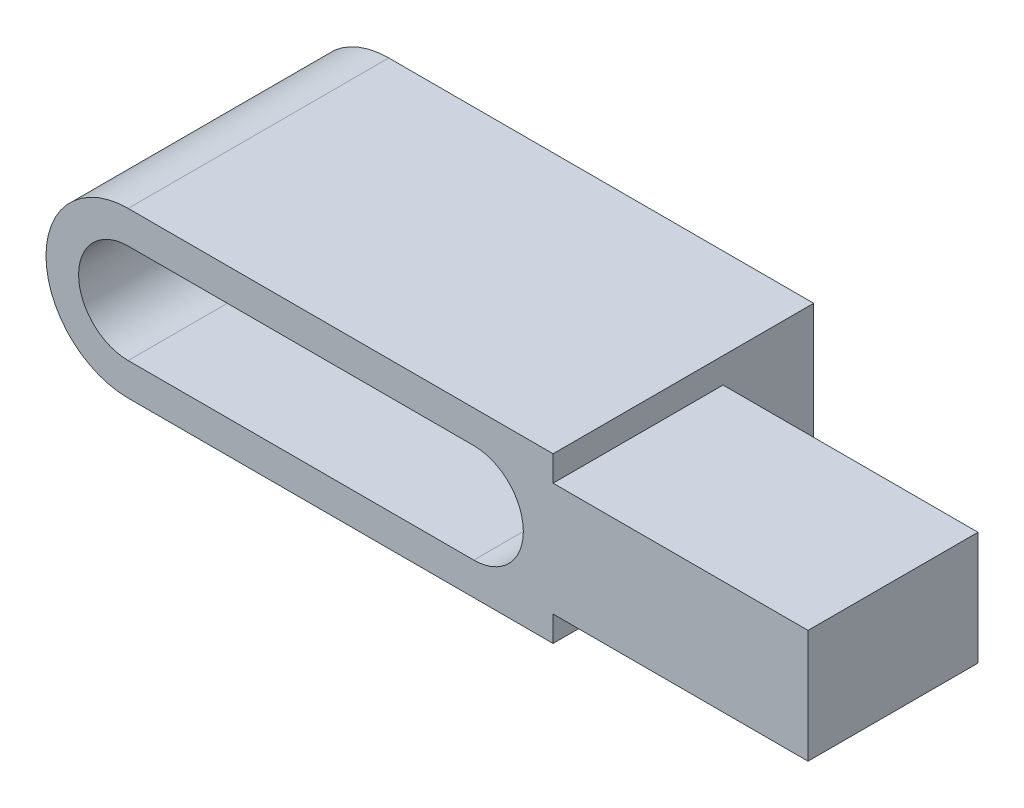
ISO-10303-21;
HEADER;
FILE_DESCRIPTION(('STEP AP214'),'2;1');
FILE_NAME('part.step','',(''),(''),'','','');
FILE_SCHEMA(('AUTOMOTIVE_DESIGN { 1 0 10303 214 1 1 1 1 }'));
ENDSEC;
DATA;
#1=APPLICATION_CONTEXT('core data for automotive mechanical design processes');
#2=APPLICATION_PROTOCOL_DEFINITION('international standard','automotive_design',2000,#1);
#3=PRODUCT_CONTEXT('',#1,'mechanical');
#4=PRODUCT('Part','Part','',(#3));
#5=PRODUCT_RELATED_PRODUCT_CATEGORY('part','',(#4));
#6=PRODUCT_DEFINITION_FORMATION('','',#4);
#7=PRODUCT_DEFINITION_CONTEXT('part definition',#1,'design');
#8=PRODUCT_DEFINITION('design','',#6,#7);
#9=PRODUCT_DEFINITION_SHAPE('','',#8);
#10=(LENGTH_UNIT() NAMED_UNIT(*) SI_UNIT(.MILLI.,.METRE.));
#11=(NAMED_UNIT(*) PLANE_ANGLE_UNIT() SI_UNIT($,.RADIAN.));
#12=(NAMED_UNIT(*) SI_UNIT($,.STERADIAN.) SOLID_ANGLE_UNIT());
#13=UNCERTAINTY_MEASURE_WITH_UNIT(LENGTH_MEASURE(1.E-05),#10,'distance_accuracy_value','');
#14=(GEOMETRIC_REPRESENTATION_CONTEXT(3) GLOBAL_UNCERTAINTY_ASSIGNED_CONTEXT((#13)) GLOBAL_UNIT_ASSIGNED_CONTEXT((#10,
#11,#12)) REPRESENTATION_CONTEXT('',''));
#15=CARTESIAN_POINT('',(0.,0.,0.));
#16=DIRECTION('',(0.,0.,1.));
#17=DIRECTION('',(1.,0.,0.));
#18=AXIS2_PLACEMENT_3D('',#15,#16,#17);
#19=CARTESIAN_POINT('',(0.,0.,3.2));
#20=DIRECTION('',(0.,0.,-1.));
#21=DIRECTION('',(-1.,0.,0.));
#22=AXIS2_PLACEMENT_3D('',#19,#20,#21);
#23=CYLINDRICAL_SURFACE('',#22,2.9);
#24=CARTESIAN_POINT('',(0.,0.,0.));
#25=DIRECTION('',(0.,0.,1.));
#26=DIRECTION('',(1.,0.,0.));
#27=AXIS2_PLACEMENT_3D('',#24,#25,#26);
#28=CIRCLE('',#27,2.9);
#29=CARTESIAN_POINT('',(0.,2.9,0.));
#30=VERTEX_POINT('',#29);
#31=CARTESIAN_POINT('',(0.,-2.9,0.));
#32=VERTEX_POINT('',#31);
#33=EDGE_CURVE('E199',#30,#32,#28,.T.);
#34=ORIENTED_EDGE('',*,*,#33,.T.);
#35=DIRECTION('',(0.,0.,-1.));
#36=VECTOR('',#35,1.);
#37=CARTESIAN_POINT('',(0.,-2.9,3.2));
#38=LINE('',#37,#36);
#39=CARTESIAN_POINT('',(0.,-2.9,9.2));
#40=VERTEX_POINT('',#39);
#41=EDGE_CURVE('E11',#40,#32,#38,.T.);
#42=ORIENTED_EDGE('',*,*,#41,.F.);
#43=CARTESIAN_POINT('',(0.,0.,9.2));
#44=DIRECTION('',(0.,0.,1.));
#45=DIRECTION('',(1.,0.,0.));
#46=AXIS2_PLACEMENT_3D('',#43,#44,#45);
#47=CIRCLE('',#46,2.9);
#48=CARTESIAN_POINT('',(0.,2.9,9.2));
#49=VERTEX_POINT('',#48);
#50=EDGE_CURVE('E161',#49,#40,#47,.T.);
#51=ORIENTED_EDGE('',*,*,#50,.F.);
#52=DIRECTION('',(0.,0.,-1.));
#53=VECTOR('',#52,1.);
#54=CARTESIAN_POINT('',(0.,2.9,3.2));
#55=LINE('',#54,#53);
#56=EDGE_CURVE('E202',#49,#30,#55,.T.);
#57=ORIENTED_EDGE('',*,*,#56,.T.);
#58=EDGE_LOOP('',(#34,#42,#51,#57));
#59=FACE_BOUND('',#58,.T.);
#60=ADVANCED_FACE('F36',(#59),#23,.T.);
#61=CARTESIAN_POINT('',(15.,-2.9,3.2));
#62=DIRECTION('',(0.,1.,0.));
#63=DIRECTION('',(-1.,0.,0.));
#64=AXIS2_PLACEMENT_3D('',#61,#62,#63);
#65=PLANE('',#64);
#66=DIRECTION('',(1.,0.,0.));
#67=VECTOR('',#66,1.);
#68=CARTESIAN_POINT('',(15.,-2.9,0.));
#69=LINE('',#68,#67);
#70=CARTESIAN_POINT('',(15.,-2.9,0.));
#71=VERTEX_POINT('',#70);
#72=EDGE_CURVE('E206',#32,#71,#69,.T.);
#73=ORIENTED_EDGE('',*,*,#72,.T.);
#74=DIRECTION('',(0.,0.,-1.));
#75=VECTOR('',#74,1.);
#76=CARTESIAN_POINT('',(15.,-2.9,3.2));
#77=LINE('',#76,#75);
#78=CARTESIAN_POINT('',(15.,-2.9,9.2));
#79=VERTEX_POINT('',#78);
#80=EDGE_CURVE('E43',#79,#71,#77,.T.);
#81=ORIENTED_EDGE('',*,*,#80,.F.);
#82=DIRECTION('',(1.,0.,0.));
#83=VECTOR('',#82,1.);
#84=CARTESIAN_POINT('',(0.,-2.9,9.2));
#85=LINE('',#84,#83);
#86=EDGE_CURVE('E164',#40,#79,#85,.T.);
#87=ORIENTED_EDGE('',*,*,#86,.F.);
#88=ORIENTED_EDGE('',*,*,#41,.T.);
#89=EDGE_LOOP('',(#73,#81,#87,#88));
#90=FACE_BOUND('',#89,.T.);
#91=ADVANCED_FACE('F259',(#90),#65,.F.);
#92=CARTESIAN_POINT('',(15.,2.9,3.2));
#93=DIRECTION('',(-1.,0.,0.));
#94=DIRECTION('',(0.,0.,1.));
#95=AXIS2_PLACEMENT_3D('',#92,#93,#94);
#96=PLANE('',#95);
#97=DIRECTION('',(0.,1.,0.));
#98=VECTOR('',#97,1.);
#99=CARTESIAN_POINT('',(15.,2.9,0.));
#100=LINE('',#99,#98);
#101=CARTESIAN_POINT('',(15.,2.9,0.));
#102=VERTEX_POINT('',#101);
#103=EDGE_CURVE('E208',#71,#102,#100,.T.);
#104=ORIENTED_EDGE('',*,*,#103,.T.);
#105=DIRECTION('',(0.,0.,-1.));
#106=VECTOR('',#105,1.);
#107=CARTESIAN_POINT('',(15.,2.9,3.2));
#108=LINE('',#107,#106);
#109=CARTESIAN_POINT('',(15.,2.9,9.2));
#110=VERTEX_POINT('',#109);
#111=EDGE_CURVE('E213',#110,#102,#108,.T.);
#112=ORIENTED_EDGE('',*,*,#111,.F.);
#113=DIRECTION('',(0.,1.,0.));
#114=VECTOR('',#113,1.);
#115=CARTESIAN_POINT('',(15.,2.9,9.2));
#116=LINE('',#115,#114);
#117=CARTESIAN_POINT('',(15.,2.,9.2));
#118=VERTEX_POINT('',#117);
#119=EDGE_CURVE('E176',#118,#110,#116,.T.);
#120=ORIENTED_EDGE('',*,*,#119,.F.);
#121=DIRECTION('',(0.,0.,-1.));
#122=VECTOR('',#121,1.);
#123=CARTESIAN_POINT('',(15.,2.,9.2));
#124=LINE('',#123,#122);
#125=CARTESIAN_POINT('',(15.,2.,3.2));
#126=VERTEX_POINT('',#125);
#127=EDGE_CURVE('E182',#118,#126,#124,.T.);
#128=ORIENTED_EDGE('',*,*,#127,.T.);
#129=DIRECTION('',(0.,1.,0.));
#130=VECTOR('',#129,1.);
#131=CARTESIAN_POINT('',(15.,2.9,3.2));
#132=LINE('',#131,#130);
#133=CARTESIAN_POINT('',(15.,-2.,3.2));
#134=VERTEX_POINT('',#133);
#135=EDGE_CURVE('E200',#134,#126,#132,.T.);
#136=ORIENTED_EDGE('',*,*,#135,.F.);
#137=DIRECTION('',(0.,0.,-1.));
#138=VECTOR('',#137,1.);
#139=CARTESIAN_POINT('',(15.,-2.,9.2));
#140=LINE('',#139,#138);
#141=CARTESIAN_POINT('',(15.,-2.,9.2));
#142=VERTEX_POINT('',#141);
#143=EDGE_CURVE('E196',#142,#134,#140,.T.);
#144=ORIENTED_EDGE('',*,*,#143,.F.);
#145=DIRECTION('',(0.,1.,0.));
#146=VECTOR('',#145,1.);
#147=CARTESIAN_POINT('',(15.,-2.9,9.2));
#148=LINE('',#147,#146);
#149=EDGE_CURVE('E168',#79,#142,#148,.T.);
#150=ORIENTED_EDGE('',*,*,#149,.F.);
#151=ORIENTED_EDGE('',*,*,#80,.T.);
#152=EDGE_LOOP('',(#104,#112,#120,#128,#136,#144,#150,#151));
#153=FACE_BOUND('',#152,.T.);
#154=ADVANCED_FACE('F219',(#153),#96,.F.);
#155=CARTESIAN_POINT('',(0.,2.9,3.2));
#156=DIRECTION('',(0.,-1.,0.));
#157=DIRECTION('',(1.,0.,0.));
#158=AXIS2_PLACEMENT_3D('',#155,#156,#157);
#159=PLANE('',#158);
#160=DIRECTION('',(-1.,0.,0.));
#161=VECTOR('',#160,1.);
#162=CARTESIAN_POINT('',(0.,2.9,0.));
#163=LINE('',#162,#161);
#164=EDGE_CURVE('E203',#102,#30,#163,.T.);
#165=ORIENTED_EDGE('',*,*,#164,.T.);
#166=ORIENTED_EDGE('',*,*,#56,.F.);
#167=DIRECTION('',(-1.,0.,0.));
#168=VECTOR('',#167,1.);
#169=CARTESIAN_POINT('',(15.,2.9,9.2));
#170=LINE('',#169,#168);
#171=EDGE_CURVE('E179',#110,#49,#170,.T.);
#172=ORIENTED_EDGE('',*,*,#171,.F.);
#173=ORIENTED_EDGE('',*,*,#111,.T.);
#174=EDGE_LOOP('',(#165,#166,#172,#173));
#175=FACE_BOUND('',#174,.T.);
#176=ADVANCED_FACE('F226',(#175),#159,.F.);
#177=CARTESIAN_POINT('',(0.,0.,0.));
#178=DIRECTION('',(0.,0.,1.));
#179=DIRECTION('',(1.,0.,0.));
#180=AXIS2_PLACEMENT_3D('',#177,#178,#179);
#181=PLANE('',#180);
#182=DIRECTION('',(1.,0.,0.));
#183=VECTOR('',#182,1.);
#184=CARTESIAN_POINT('',(12.2,-1.75,0.));
#185=LINE('',#184,#183);
#186=CARTESIAN_POINT('',(0.,-1.75,0.));
#187=VERTEX_POINT('',#186);
#188=CARTESIAN_POINT('',(12.2,-1.75,0.));
#189=VERTEX_POINT('',#188);
#190=EDGE_CURVE('E132',#187,#189,#185,.T.);
#191=ORIENTED_EDGE('',*,*,#190,.T.);
#192=CARTESIAN_POINT('',(12.2,0.,0.));
#193=DIRECTION('',(0.,0.,1.));
#194=DIRECTION('',(1.,0.,0.));
#195=AXIS2_PLACEMENT_3D('',#192,#193,#194);
#196=CIRCLE('',#195,1.75);
#197=CARTESIAN_POINT('',(12.2,1.75,0.));
#198=VERTEX_POINT('',#197);
#199=EDGE_CURVE('E126',#189,#198,#196,.T.);
#200=ORIENTED_EDGE('',*,*,#199,.T.);
#201=DIRECTION('',(-1.,0.,0.));
#202=VECTOR('',#201,1.);
#203=CARTESIAN_POINT('',(0.,1.75,0.));
#204=LINE('',#203,#202);
#205=CARTESIAN_POINT('',(0.,1.75,0.));
#206=VERTEX_POINT('',#205);
#207=EDGE_CURVE('E135',#198,#206,#204,.T.);
#208=ORIENTED_EDGE('',*,*,#207,.T.);
#209=CARTESIAN_POINT('',(0.,0.,0.));
#210=DIRECTION('',(0.,0.,1.));
#211=DIRECTION('',(1.,0.,0.));
#212=AXIS2_PLACEMENT_3D('',#209,#210,#211);
#213=CIRCLE('',#212,1.75);
#214=EDGE_CURVE('E50',#206,#187,#213,.T.);
#215=ORIENTED_EDGE('',*,*,#214,.T.);
#216=EDGE_LOOP('',(#191,#200,#208,#215));
#217=FACE_BOUND('',#216,.T.);
#218=ORIENTED_EDGE('',*,*,#33,.F.);
#219=ORIENTED_EDGE('',*,*,#164,.F.);
#220=ORIENTED_EDGE('',*,*,#103,.F.);
#221=ORIENTED_EDGE('',*,*,#72,.F.);
#222=EDGE_LOOP('',(#218,#219,#220,#221));
#223=FACE_BOUND('',#222,.T.);
#224=ADVANCED_FACE('F139',(#217,#223),#181,.F.);
#225=CARTESIAN_POINT('',(0.,0.,3.2));
#226=DIRECTION('',(0.,0.,1.));
#227=DIRECTION('',(1.,0.,0.));
#228=AXIS2_PLACEMENT_3D('',#225,#226,#227);
#229=PLANE('',#228);
#230=DIRECTION('',(1.,0.,0.));
#231=VECTOR('',#230,1.);
#232=CARTESIAN_POINT('',(15.,-2.,3.2));
#233=LINE('',#232,#231);
#234=CARTESIAN_POINT('',(24.,-2.,3.2));
#235=VERTEX_POINT('',#234);
#236=EDGE_CURVE('E157',#134,#235,#233,.T.);
#237=ORIENTED_EDGE('',*,*,#236,.F.);
#238=ORIENTED_EDGE('',*,*,#135,.T.);
#239=DIRECTION('',(-1.,0.,0.));
#240=VECTOR('',#239,1.);
#241=CARTESIAN_POINT('',(15.,2.,3.2));
#242=LINE('',#241,#240);
#243=CARTESIAN_POINT('',(24.,2.,3.2));
#244=VERTEX_POINT('',#243);
#245=EDGE_CURVE('E165',#244,#126,#242,.T.);
#246=ORIENTED_EDGE('',*,*,#245,.F.);
#247=DIRECTION('',(0.,1.,0.));
#248=VECTOR('',#247,1.);
#249=CARTESIAN_POINT('',(24.,2.,3.2));
#250=LINE('',#249,#248);
#251=EDGE_CURVE('E184',#235,#244,#250,.T.);
#252=ORIENTED_EDGE('',*,*,#251,.F.);
#253=EDGE_LOOP('',(#237,#238,#246,#252));
#254=FACE_BOUND('',#253,.T.);
#255=ADVANCED_FACE('F242',(#254),#229,.F.);
#256=CARTESIAN_POINT('',(15.,-2.,9.2));
#257=DIRECTION('',(0.,1.,0.));
#258=DIRECTION('',(0.,0.,1.));
#259=AXIS2_PLACEMENT_3D('',#256,#257,#258);
#260=PLANE('',#259);
#261=ORIENTED_EDGE('',*,*,#236,.T.);
#262=DIRECTION('',(0.,0.,-1.));
#263=VECTOR('',#262,1.);
#264=CARTESIAN_POINT('',(24.,-2.,9.2));
#265=LINE('',#264,#263);
#266=CARTESIAN_POINT('',(24.,-2.,9.2));
#267=VERTEX_POINT('',#266);
#268=EDGE_CURVE('E193',#267,#235,#265,.T.);
#269=ORIENTED_EDGE('',*,*,#268,.F.);
#270=DIRECTION('',(1.,0.,0.));
#271=VECTOR('',#270,1.);
#272=CARTESIAN_POINT('',(15.,-2.,9.2));
#273=LINE('',#272,#271);
#274=EDGE_CURVE('E170',#142,#267,#273,.T.);
#275=ORIENTED_EDGE('',*,*,#274,.F.);
#276=ORIENTED_EDGE('',*,*,#143,.T.);
#277=EDGE_LOOP('',(#261,#269,#275,#276));
#278=FACE_BOUND('',#277,.T.);
#279=ADVANCED_FACE('F245',(#278),#260,.F.);
#280=CARTESIAN_POINT('',(24.,2.,9.2));
#281=DIRECTION('',(-1.,0.,0.));
#282=DIRECTION('',(0.,0.,1.));
#283=AXIS2_PLACEMENT_3D('',#280,#281,#282);
#284=PLANE('',#283);
#285=ORIENTED_EDGE('',*,*,#251,.T.);
#286=DIRECTION('',(0.,0.,-1.));
#287=VECTOR('',#286,1.);
#288=CARTESIAN_POINT('',(24.,2.,9.2));
#289=LINE('',#288,#287);
#290=CARTESIAN_POINT('',(24.,2.,9.2));
#291=VERTEX_POINT('',#290);
#292=EDGE_CURVE('E190',#291,#244,#289,.T.);
#293=ORIENTED_EDGE('',*,*,#292,.F.);
#294=DIRECTION('',(0.,1.,0.));
#295=VECTOR('',#294,1.);
#296=CARTESIAN_POINT('',(24.,2.,9.2));
#297=LINE('',#296,#295);
#298=EDGE_CURVE('E172',#267,#291,#297,.T.);
#299=ORIENTED_EDGE('',*,*,#298,.F.);
#300=ORIENTED_EDGE('',*,*,#268,.T.);
#301=EDGE_LOOP('',(#285,#293,#299,#300));
#302=FACE_BOUND('',#301,.T.);
#303=ADVANCED_FACE('F249',(#302),#284,.F.);
#304=CARTESIAN_POINT('',(15.,2.,9.2));
#305=DIRECTION('',(0.,-1.,0.));
#306=DIRECTION('',(0.,0.,-1.));
#307=AXIS2_PLACEMENT_3D('',#304,#305,#306);
#308=PLANE('',#307);
#309=ORIENTED_EDGE('',*,*,#245,.T.);
#310=ORIENTED_EDGE('',*,*,#127,.F.);
#311=DIRECTION('',(-1.,0.,0.));
#312=VECTOR('',#311,1.);
#313=CARTESIAN_POINT('',(15.,2.,9.2));
#314=LINE('',#313,#312);
#315=EDGE_CURVE('E174',#291,#118,#314,.T.);
#316=ORIENTED_EDGE('',*,*,#315,.F.);
#317=ORIENTED_EDGE('',*,*,#292,.T.);
#318=EDGE_LOOP('',(#309,#310,#316,#317));
#319=FACE_BOUND('',#318,.T.);
#320=ADVANCED_FACE('F236',(#319),#308,.F.);
#321=CARTESIAN_POINT('',(0.,0.,9.2));
#322=DIRECTION('',(0.,0.,1.));
#323=DIRECTION('',(1.,0.,0.));
#324=AXIS2_PLACEMENT_3D('',#321,#322,#323);
#325=PLANE('',#324);
#326=CARTESIAN_POINT('',(12.2,0.,9.2));
#327=DIRECTION('',(0.,0.,1.));
#328=DIRECTION('',(1.,0.,0.));
#329=AXIS2_PLACEMENT_3D('',#326,#327,#328);
#330=CIRCLE('',#329,1.75);
#331=CARTESIAN_POINT('',(12.2,-1.75,9.2));
#332=VERTEX_POINT('',#331);
#333=CARTESIAN_POINT('',(12.2,1.75,9.2));
#334=VERTEX_POINT('',#333);
#335=EDGE_CURVE('E58',#332,#334,#330,.T.);
#336=ORIENTED_EDGE('',*,*,#335,.F.);
#337=DIRECTION('',(1.,0.,0.));
#338=VECTOR('',#337,1.);
#339=CARTESIAN_POINT('',(12.2,-1.75,9.2));
#340=LINE('',#339,#338);
#341=CARTESIAN_POINT('',(0.,-1.75,9.2));
#342=VERTEX_POINT('',#341);
#343=EDGE_CURVE('E142',#342,#332,#340,.T.);
#344=ORIENTED_EDGE('',*,*,#343,.F.);
#345=CARTESIAN_POINT('',(0.,0.,9.2));
#346=DIRECTION('',(0.,0.,1.));
#347=DIRECTION('',(1.,0.,0.));
#348=AXIS2_PLACEMENT_3D('',#345,#346,#347);
#349=CIRCLE('',#348,1.75);
#350=CARTESIAN_POINT('',(0.,1.75,9.2));
#351=VERTEX_POINT('',#350);
#352=EDGE_CURVE('E145',#351,#342,#349,.T.);
#353=ORIENTED_EDGE('',*,*,#352,.F.);
#354=DIRECTION('',(-1.,0.,0.));
#355=VECTOR('',#354,1.);
#356=CARTESIAN_POINT('',(0.,1.75,9.2));
#357=LINE('',#356,#355);
#358=EDGE_CURVE('E151',#334,#351,#357,.T.);
#359=ORIENTED_EDGE('',*,*,#358,.F.);
#360=EDGE_LOOP('',(#336,#344,#353,#359));
#361=FACE_BOUND('',#360,.T.);
#362=ORIENTED_EDGE('',*,*,#50,.T.);
#363=ORIENTED_EDGE('',*,*,#86,.T.);
#364=ORIENTED_EDGE('',*,*,#149,.T.);
#365=ORIENTED_EDGE('',*,*,#274,.T.);
#366=ORIENTED_EDGE('',*,*,#298,.T.);
#367=ORIENTED_EDGE('',*,*,#315,.T.);
#368=ORIENTED_EDGE('',*,*,#119,.T.);
#369=ORIENTED_EDGE('',*,*,#171,.T.);
#370=EDGE_LOOP('',(#362,#363,#364,#365,#366,#367,#368,#369));
#371=FACE_BOUND('',#370,.T.);
#372=ADVANCED_FACE('F231',(#361,#371),#325,.T.);
#373=CARTESIAN_POINT('',(12.2,0.,0.));
#374=DIRECTION('',(0.,0.,1.));
#375=DIRECTION('',(1.,0.,0.));
#376=AXIS2_PLACEMENT_3D('',#373,#374,#375);
#377=CYLINDRICAL_SURFACE('',#376,1.75);
#378=ORIENTED_EDGE('',*,*,#335,.T.);
#379=DIRECTION('',(0.,0.,1.));
#380=VECTOR('',#379,1.);
#381=CARTESIAN_POINT('',(12.2,1.75,0.));
#382=LINE('',#381,#380);
#383=EDGE_CURVE('E122',#198,#334,#382,.T.);
#384=ORIENTED_EDGE('',*,*,#383,.F.);
#385=ORIENTED_EDGE('',*,*,#199,.F.);
#386=DIRECTION('',(0.,0.,1.));
#387=VECTOR('',#386,1.);
#388=CARTESIAN_POINT('',(12.2,-1.75,0.));
#389=LINE('',#388,#387);
#390=EDGE_CURVE('E155',#189,#332,#389,.T.);
#391=ORIENTED_EDGE('',*,*,#390,.T.);
#392=EDGE_LOOP('',(#378,#384,#385,#391));
#393=FACE_BOUND('',#392,.T.);
#394=ADVANCED_FACE('F124',(#393),#377,.F.);
#395=CARTESIAN_POINT('',(12.2,-1.75,0.));
#396=DIRECTION('',(0.,-1.,0.));
#397=DIRECTION('',(1.,0.,0.));
#398=AXIS2_PLACEMENT_3D('',#395,#396,#397);
#399=PLANE('',#398);
#400=ORIENTED_EDGE('',*,*,#343,.T.);
#401=ORIENTED_EDGE('',*,*,#390,.F.);
#402=ORIENTED_EDGE('',*,*,#190,.F.);
#403=DIRECTION('',(0.,0.,1.));
#404=VECTOR('',#403,1.);
#405=CARTESIAN_POINT('',(0.,-1.75,0.));
#406=LINE('',#405,#404);
#407=EDGE_CURVE('E158',#187,#342,#406,.T.);
#408=ORIENTED_EDGE('',*,*,#407,.T.);
#409=EDGE_LOOP('',(#400,#401,#402,#408));
#410=FACE_BOUND('',#409,.T.);
#411=ADVANCED_FACE('F283',(#410),#399,.F.);
#412=CARTESIAN_POINT('',(0.,0.,0.));
#413=DIRECTION('',(0.,0.,1.));
#414=DIRECTION('',(1.,0.,0.));
#415=AXIS2_PLACEMENT_3D('',#412,#413,#414);
#416=CYLINDRICAL_SURFACE('',#415,1.75);
#417=ORIENTED_EDGE('',*,*,#352,.T.);
#418=ORIENTED_EDGE('',*,*,#407,.F.);
#419=ORIENTED_EDGE('',*,*,#214,.F.);
#420=DIRECTION('',(0.,0.,1.));
#421=VECTOR('',#420,1.);
#422=CARTESIAN_POINT('',(0.,1.75,0.));
#423=LINE('',#422,#421);
#424=EDGE_CURVE('E131',#206,#351,#423,.T.);
#425=ORIENTED_EDGE('',*,*,#424,.T.);
#426=EDGE_LOOP('',(#417,#418,#419,#425));
#427=FACE_BOUND('',#426,.T.);
#428=ADVANCED_FACE('F286',(#427),#416,.F.);
#429=CARTESIAN_POINT('',(0.,1.75,0.));
#430=DIRECTION('',(0.,1.,0.));
#431=DIRECTION('',(-1.,0.,0.));
#432=AXIS2_PLACEMENT_3D('',#429,#430,#431);
#433=PLANE('',#432);
#434=ORIENTED_EDGE('',*,*,#358,.T.);
#435=ORIENTED_EDGE('',*,*,#424,.F.);
#436=ORIENTED_EDGE('',*,*,#207,.F.);
#437=ORIENTED_EDGE('',*,*,#383,.T.);
#438=EDGE_LOOP('',(#434,#435,#436,#437));
#439=FACE_BOUND('',#438,.T.);
#440=ADVANCED_FACE('F136',(#439),#433,.F.);
#441=CLOSED_SHELL('',(#60,#91,#154,#176,#224,#255,#279,#303,#320,#372,#394,#411,#428,#440));
#442=MANIFOLD_SOLID_BREP('B2',#441);
#443=ADVANCED_BREP_SHAPE_REPRESENTATION('',(#18,#442),#14);
#444=SHAPE_DEFINITION_REPRESENTATION(#9,#443);
ENDSEC;
END-ISO-10303-21;
